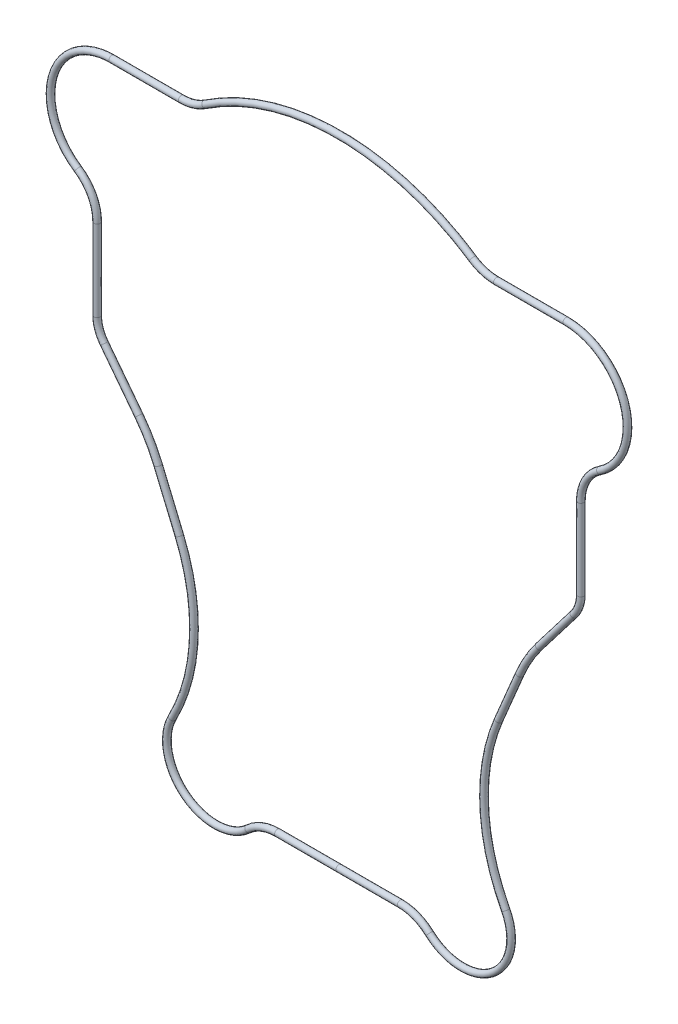
ISO-10303-21;
HEADER;
FILE_DESCRIPTION(('STEP AP214'),'2;1');
FILE_NAME('part.step','',(''),(''),'','','');
FILE_SCHEMA(('AUTOMOTIVE_DESIGN { 1 0 10303 214 1 1 1 1 }'));
ENDSEC;
DATA;
#1=APPLICATION_CONTEXT('core data for automotive mechanical design processes');
#2=APPLICATION_PROTOCOL_DEFINITION('international standard','automotive_design',2000,#1);
#3=PRODUCT_CONTEXT('',#1,'mechanical');
#4=PRODUCT('Part','Part','',(#3));
#5=PRODUCT_RELATED_PRODUCT_CATEGORY('part','',(#4));
#6=PRODUCT_DEFINITION_FORMATION('','',#4);
#7=PRODUCT_DEFINITION_CONTEXT('part definition',#1,'design');
#8=PRODUCT_DEFINITION('design','',#6,#7);
#9=PRODUCT_DEFINITION_SHAPE('','',#8);
#10=(LENGTH_UNIT() NAMED_UNIT(*) SI_UNIT(.MILLI.,.METRE.));
#11=(NAMED_UNIT(*) PLANE_ANGLE_UNIT() SI_UNIT($,.RADIAN.));
#12=(NAMED_UNIT(*) SI_UNIT($,.STERADIAN.) SOLID_ANGLE_UNIT());
#13=UNCERTAINTY_MEASURE_WITH_UNIT(LENGTH_MEASURE(1.E-05),#10,'distance_accuracy_value','');
#14=(GEOMETRIC_REPRESENTATION_CONTEXT(3) GLOBAL_UNCERTAINTY_ASSIGNED_CONTEXT((#13)) GLOBAL_UNIT_ASSIGNED_CONTEXT((#10,
#11,#12)) REPRESENTATION_CONTEXT('',''));
#15=CARTESIAN_POINT('',(0.,0.,0.));
#16=DIRECTION('',(0.,0.,1.));
#17=DIRECTION('',(1.,0.,0.));
#18=AXIS2_PLACEMENT_3D('',#15,#16,#17);
#19=CARTESIAN_POINT('',(0.,-128.,0.));
#20=DIRECTION('',(-1.,0.,0.));
#21=DIRECTION('',(0.,0.,1.));
#22=AXIS2_PLACEMENT_3D('',#19,#20,#21);
#23=CYLINDRICAL_SURFACE('',#22,1.);
#24=CARTESIAN_POINT('',(-19.8992537451964,-128.,0.));
#25=DIRECTION('',(1.,0.,0.));
#26=DIRECTION('',(0.,0.,-1.));
#27=AXIS2_PLACEMENT_3D('',#24,#25,#26);
#28=CIRCLE('',#27,1.);
#29=CARTESIAN_POINT('',(-19.8992537451964,-127.,0.));
#30=VERTEX_POINT('',#29);
#31=EDGE_CURVE('E122',#30,#30,#28,.T.);
#32=ORIENTED_EDGE('',*,*,#31,.T.);
#33=EDGE_LOOP('',(#32));
#34=FACE_BOUND('',#33,.T.);
#35=CARTESIAN_POINT('',(0.,-128.,0.));
#36=DIRECTION('',(1.,0.,0.));
#37=DIRECTION('',(0.,0.,-1.));
#38=AXIS2_PLACEMENT_3D('',#35,#36,#37);
#39=CIRCLE('',#38,1.);
#40=CARTESIAN_POINT('',(0.,-128.,-1.));
#41=VERTEX_POINT('',#40);
#42=EDGE_CURVE('E125',#41,#41,#39,.T.);
#43=ORIENTED_EDGE('',*,*,#42,.F.);
#44=EDGE_LOOP('',(#43));
#45=FACE_BOUND('',#44,.T.);
#46=ADVANCED_FACE('F39',(#34,#45),#23,.T.);
#47=CARTESIAN_POINT('',(-19.8992537451964,-142.,0.));
#48=DIRECTION('',(0.,0.,1.));
#49=DIRECTION('',(1.,0.,0.));
#50=AXIS2_PLACEMENT_3D('',#47,#48,#49);
#51=TOROIDAL_SURFACE('',#50,14.,1.);
#52=CARTESIAN_POINT('',(-29.3425573548357,-131.664429530201,0.));
#53=DIRECTION('',(0.738255033557046,0.674521686402806,0.));
#54=DIRECTION('',(0.,0.,-1.));
#55=AXIS2_PLACEMENT_3D('',#52,#53,#54);
#56=CIRCLE('',#55,1.);
#57=CARTESIAN_POINT('',(-30.0170790412385,-130.926174496644,0.));
#58=VERTEX_POINT('',#57);
#59=EDGE_CURVE('E119',#58,#58,#56,.T.);
#60=CARTESIAN_POINT('',(-19.8992537451964,-142.,0.));
#61=DIRECTION('',(0.,0.,1.));
#62=DIRECTION('',(1.,0.,0.));
#63=AXIS2_PLACEMENT_3D('',#60,#61,#62);
#64=CIRCLE('',#63,15.);
#65=EDGE_CURVE('',#30,#58,#64,.T.);
#66=ORIENTED_EDGE('',*,*,#31,.F.);
#67=ORIENTED_EDGE('',*,*,#59,.T.);
#68=ORIENTED_EDGE('',*,*,#65,.T.);
#69=ORIENTED_EDGE('',*,*,#65,.F.);
#70=EDGE_LOOP('',(#66,#68,#67,#69));
#71=FACE_BOUND('',#70,.T.);
#72=ADVANCED_FACE('F132',(#71),#51,.T.);
#73=CARTESIAN_POINT('',(-40.,-120.,0.));
#74=DIRECTION('',(0.,0.,-1.));
#75=DIRECTION('',(-1.,0.,0.));
#76=AXIS2_PLACEMENT_3D('',#73,#74,#75);
#77=TOROIDAL_SURFACE('',#76,15.8,1.);
#78=CARTESIAN_POINT('',(-53.9991278559812,-112.674399732999,0.));
#79=DIRECTION('',(-0.463645586519069,-0.886020750378561,0.));
#80=DIRECTION('',(0.,0.,-1.));
#81=AXIS2_PLACEMENT_3D('',#78,#79,#80);
#82=CIRCLE('',#81,1.);
#83=CARTESIAN_POINT('',(-53.1131071056026,-113.138045319518,0.));
#84=VERTEX_POINT('',#83);
#85=EDGE_CURVE('E116',#84,#84,#82,.T.);
#86=ORIENTED_EDGE('',*,*,#85,.T.);
#87=EDGE_LOOP('',(#86));
#88=FACE_BOUND('',#87,.T.);
#89=ORIENTED_EDGE('',*,*,#59,.F.);
#90=EDGE_LOOP('',(#89));
#91=FACE_BOUND('',#90,.T.);
#92=ADVANCED_FACE('F138',(#88,#91),#77,.T.);
#93=CARTESIAN_POINT('',(-108.407035747537,-84.2032986274344,0.));
#94=DIRECTION('',(0.,0.,1.));
#95=DIRECTION('',(1.,0.,0.));
#96=AXIS2_PLACEMENT_3D('',#93,#94,#95);
#97=TOROIDAL_SURFACE('',#96,61.4070357475369,1.);
#98=CARTESIAN_POINT('',(-51.7900933453479,-60.4262956134611,0.));
#99=DIRECTION('',(0.387203236966653,-0.921994388964784,0.));
#100=DIRECTION('',(0.,0.,-1.));
#101=AXIS2_PLACEMENT_3D('',#98,#99,#100);
#102=CIRCLE('',#101,1.);
#103=CARTESIAN_POINT('',(-50.8680989563831,-60.0390923764945,0.));
#104=VERTEX_POINT('',#103);
#105=EDGE_CURVE('E113',#104,#104,#102,.T.);
#106=CARTESIAN_POINT('',(-108.407035747537,-84.2032986274344,0.));
#107=DIRECTION('',(0.,0.,1.));
#108=DIRECTION('',(1.,0.,0.));
#109=AXIS2_PLACEMENT_3D('',#106,#107,#108);
#110=CIRCLE('',#109,62.4070357475369);
#111=EDGE_CURVE('',#84,#104,#110,.T.);
#112=ORIENTED_EDGE('',*,*,#85,.F.);
#113=ORIENTED_EDGE('',*,*,#105,.T.);
#114=ORIENTED_EDGE('',*,*,#111,.T.);
#115=ORIENTED_EDGE('',*,*,#111,.F.);
#116=EDGE_LOOP('',(#112,#114,#113,#115));
#117=FACE_BOUND('',#116,.T.);
#118=ADVANCED_FACE('F144',(#117),#97,.T.);
#119=CARTESIAN_POINT('',(-51.7900933453479,-60.4262956134611,0.));
#120=DIRECTION('',(-0.387203236966652,0.921994388964785,0.));
#121=DIRECTION('',(-0.921994388964785,-0.387203236966652,0.));
#122=AXIS2_PLACEMENT_3D('',#119,#120,#121);
#123=CYLINDRICAL_SURFACE('',#122,1.);
#124=CARTESIAN_POINT('',(-58.6290799510559,-44.1415472573643,0.));
#125=DIRECTION('',(0.387203236966652,-0.921994388964785,0.));
#126=DIRECTION('',(0.,0.,-1.));
#127=AXIS2_PLACEMENT_3D('',#124,#125,#126);
#128=CIRCLE('',#127,1.);
#129=CARTESIAN_POINT('',(-57.7070855620911,-43.7543440203976,0.));
#130=VERTEX_POINT('',#129);
#131=EDGE_CURVE('E110',#130,#130,#128,.T.);
#132=ORIENTED_EDGE('',*,*,#131,.T.);
#133=EDGE_LOOP('',(#132));
#134=FACE_BOUND('',#133,.T.);
#135=ORIENTED_EDGE('',*,*,#105,.F.);
#136=EDGE_LOOP('',(#135));
#137=FACE_BOUND('',#136,.T.);
#138=ADVANCED_FACE('F148',(#134,#137),#123,.T.);
#139=CARTESIAN_POINT('',(-103.80680501033,-63.1145058687303,0.));
#140=DIRECTION('',(0.,0.,1.));
#141=DIRECTION('',(1.,0.,0.));
#142=AXIS2_PLACEMENT_3D('',#139,#140,#141);
#143=TOROIDAL_SURFACE('',#142,49.,1.);
#144=CARTESIAN_POINT('',(-64.9324913360597,-33.285195847303,0.));
#145=DIRECTION('',(0.608761429008719,-0.793353340291236,0.));
#146=DIRECTION('',(0.,0.,-1.));
#147=AXIS2_PLACEMENT_3D('',#144,#145,#146);
#148=CIRCLE('',#147,1.);
#149=CARTESIAN_POINT('',(-64.1391379957685,-32.6764344182943,0.));
#150=VERTEX_POINT('',#149);
#151=EDGE_CURVE('E107',#150,#150,#148,.T.);
#152=CARTESIAN_POINT('',(-103.80680501033,-63.1145058687303,0.));
#153=DIRECTION('',(0.,0.,1.));
#154=DIRECTION('',(1.,0.,0.));
#155=AXIS2_PLACEMENT_3D('',#152,#153,#154);
#156=CIRCLE('',#155,50.);
#157=EDGE_CURVE('',#130,#150,#156,.T.);
#158=ORIENTED_EDGE('',*,*,#131,.F.);
#159=ORIENTED_EDGE('',*,*,#151,.T.);
#160=ORIENTED_EDGE('',*,*,#157,.T.);
#161=ORIENTED_EDGE('',*,*,#157,.F.);
#162=EDGE_LOOP('',(#158,#160,#159,#161));
#163=FACE_BOUND('',#162,.T.);
#164=ADVANCED_FACE('F152',(#163),#143,.T.);
#165=CARTESIAN_POINT('',(-64.9324913360597,-33.285195847303,0.));
#166=DIRECTION('',(-0.608761429008717,0.793353340291238,0.));
#167=DIRECTION('',(-0.793353340291238,-0.608761429008717,0.));
#168=AXIS2_PLACEMENT_3D('',#165,#166,#167);
#169=CYLINDRICAL_SURFACE('',#168,1.);
#170=CARTESIAN_POINT('',(-76.1268867432037,-18.6963757190959,0.));
#171=DIRECTION('',(0.608761429008717,-0.793353340291238,0.));
#172=DIRECTION('',(0.,0.,-1.));
#173=AXIS2_PLACEMENT_3D('',#170,#171,#172);
#174=CIRCLE('',#173,1.);
#175=CARTESIAN_POINT('',(-76.9202400834949,-19.3051371481046,0.));
#176=VERTEX_POINT('',#175);
#177=EDGE_CURVE('E104',#176,#176,#174,.T.);
#178=ORIENTED_EDGE('',*,*,#177,.T.);
#179=EDGE_LOOP('',(#178));
#180=FACE_BOUND('',#179,.T.);
#181=ORIENTED_EDGE('',*,*,#151,.F.);
#182=EDGE_LOOP('',(#181));
#183=FACE_BOUND('',#182,.T.);
#184=ADVANCED_FACE('F156',(#180,#183),#169,.T.);
#185=CARTESIAN_POINT('',(-67.4,-12.,0.));
#186=DIRECTION('',(0.,0.,-1.));
#187=DIRECTION('',(-1.,0.,0.));
#188=AXIS2_PLACEMENT_3D('',#185,#186,#187);
#189=TOROIDAL_SURFACE('',#188,11.,1.);
#190=CARTESIAN_POINT('',(-78.4,-12.,0.));
#191=DIRECTION('',(0.,-1.,0.));
#192=DIRECTION('',(0.,0.,-1.));
#193=AXIS2_PLACEMENT_3D('',#190,#191,#192);
#194=CIRCLE('',#193,1.);
#195=CARTESIAN_POINT('',(-79.4,-12.,0.));
#196=VERTEX_POINT('',#195);
#197=EDGE_CURVE('E101',#196,#196,#194,.T.);
#198=CARTESIAN_POINT('',(-67.4,-12.,0.));
#199=DIRECTION('',(0.,0.,-1.));
#200=DIRECTION('',(-1.,0.,0.));
#201=AXIS2_PLACEMENT_3D('',#198,#199,#200);
#202=CIRCLE('',#201,12.);
#203=EDGE_CURVE('',#176,#196,#202,.T.);
#204=ORIENTED_EDGE('',*,*,#177,.F.);
#205=ORIENTED_EDGE('',*,*,#197,.T.);
#206=ORIENTED_EDGE('',*,*,#203,.T.);
#207=ORIENTED_EDGE('',*,*,#203,.F.);
#208=EDGE_LOOP('',(#204,#206,#205,#207));
#209=FACE_BOUND('',#208,.T.);
#210=ADVANCED_FACE('F160',(#209),#189,.T.);
#211=CARTESIAN_POINT('',(-78.4,-12.,0.));
#212=DIRECTION('',(0.,1.,0.));
#213=DIRECTION('',(0.,0.,1.));
#214=AXIS2_PLACEMENT_3D('',#211,#212,#213);
#215=CYLINDRICAL_SURFACE('',#214,1.);
#216=CARTESIAN_POINT('',(-78.4,14.2825046709325,0.));
#217=DIRECTION('',(0.,-1.,0.));
#218=DIRECTION('',(0.,0.,-1.));
#219=AXIS2_PLACEMENT_3D('',#216,#217,#218);
#220=CIRCLE('',#219,1.);
#221=CARTESIAN_POINT('',(-77.4,14.2825046709325,0.));
#222=VERTEX_POINT('',#221);
#223=EDGE_CURVE('E98',#222,#222,#220,.T.);
#224=ORIENTED_EDGE('',*,*,#223,.T.);
#225=EDGE_LOOP('',(#224));
#226=FACE_BOUND('',#225,.T.);
#227=ORIENTED_EDGE('',*,*,#197,.F.);
#228=EDGE_LOOP('',(#227));
#229=FACE_BOUND('',#228,.T.);
#230=ADVANCED_FACE('F164',(#226,#229),#215,.T.);
#231=CARTESIAN_POINT('',(-92.4,14.2825046709325,0.));
#232=DIRECTION('',(0.,0.,1.));
#233=DIRECTION('',(1.,0.,0.));
#234=AXIS2_PLACEMENT_3D('',#231,#232,#233);
#235=TOROIDAL_SURFACE('',#234,14.,1.);
#236=CARTESIAN_POINT('',(-84.6410097493652,25.935747579692,0.));
#237=DIRECTION('',(0.832374493482823,-0.554213589331057,0.));
#238=DIRECTION('',(0.,0.,-1.));
#239=AXIS2_PLACEMENT_3D('',#236,#237,#238);
#240=CIRCLE('',#239,1.);
#241=CARTESIAN_POINT('',(-84.0867961600342,26.7681220731748,0.));
#242=VERTEX_POINT('',#241);
#243=EDGE_CURVE('E95',#242,#242,#240,.T.);
#244=CARTESIAN_POINT('',(-92.4,14.2825046709325,0.));
#245=DIRECTION('',(0.,0.,1.));
#246=DIRECTION('',(1.,0.,0.));
#247=AXIS2_PLACEMENT_3D('',#244,#245,#246);
#248=CIRCLE('',#247,15.);
#249=EDGE_CURVE('',#222,#242,#248,.T.);
#250=ORIENTED_EDGE('',*,*,#223,.F.);
#251=ORIENTED_EDGE('',*,*,#243,.T.);
#252=ORIENTED_EDGE('',*,*,#249,.T.);
#253=ORIENTED_EDGE('',*,*,#249,.F.);
#254=EDGE_LOOP('',(#250,#252,#251,#253));
#255=FACE_BOUND('',#254,.T.);
#256=ADVANCED_FACE('F168',(#255),#235,.T.);
#257=CARTESIAN_POINT('',(-73.6121593216772,42.5000000000001,0.));
#258=DIRECTION('',(0.,0.,-1.));
#259=DIRECTION('',(-1.,0.,0.));
#260=AXIS2_PLACEMENT_3D('',#257,#258,#259);
#261=TOROIDAL_SURFACE('',#260,19.8999999999999,1.);
#262=CARTESIAN_POINT('',(-73.6121593216772,62.4,0.));
#263=DIRECTION('',(-1.,0.,0.));
#264=DIRECTION('',(0.,0.,-1.));
#265=AXIS2_PLACEMENT_3D('',#262,#263,#264);
#266=CIRCLE('',#265,1.);
#267=CARTESIAN_POINT('',(-73.6121593216772,62.4,-1.));
#268=VERTEX_POINT('',#267);
#269=EDGE_CURVE('E92',#268,#268,#266,.T.);
#270=ORIENTED_EDGE('',*,*,#269,.T.);
#271=EDGE_LOOP('',(#270));
#272=FACE_BOUND('',#271,.T.);
#273=ORIENTED_EDGE('',*,*,#243,.F.);
#274=EDGE_LOOP('',(#273));
#275=FACE_BOUND('',#274,.T.);
#276=ADVANCED_FACE('F172',(#272,#275),#261,.T.);
#277=CARTESIAN_POINT('',(-73.6121593216772,62.4,0.));
#278=DIRECTION('',(1.,0.,0.));
#279=DIRECTION('',(0.,0.,-1.));
#280=AXIS2_PLACEMENT_3D('',#277,#278,#279);
#281=CYLINDRICAL_SURFACE('',#280,1.);
#282=CARTESIAN_POINT('',(-51.074944933891,62.4,0.));
#283=DIRECTION('',(-1.,0.,0.));
#284=DIRECTION('',(0.,0.,-1.));
#285=AXIS2_PLACEMENT_3D('',#282,#283,#284);
#286=CIRCLE('',#285,1.);
#287=CARTESIAN_POINT('',(-51.074944933891,61.4,0.));
#288=VERTEX_POINT('',#287);
#289=EDGE_CURVE('E89',#288,#288,#286,.T.);
#290=ORIENTED_EDGE('',*,*,#289,.T.);
#291=EDGE_LOOP('',(#290));
#292=FACE_BOUND('',#291,.T.);
#293=ORIENTED_EDGE('',*,*,#269,.F.);
#294=EDGE_LOOP('',(#293));
#295=FACE_BOUND('',#294,.T.);
#296=ADVANCED_FACE('F176',(#292,#295),#281,.T.);
#297=CARTESIAN_POINT('',(-51.074944933891,76.4,0.));
#298=DIRECTION('',(0.,0.,1.));
#299=DIRECTION('',(1.,0.,0.));
#300=AXIS2_PLACEMENT_3D('',#297,#298,#299);
#301=TOROIDAL_SURFACE('',#300,14.,1.);
#302=CARTESIAN_POINT('',(-43.2942133879229,64.7612622415669,0.));
#303=DIRECTION('',(-0.831338411316649,-0.555766538997725,0.));
#304=DIRECTION('',(0.,0.,-1.));
#305=AXIS2_PLACEMENT_3D('',#302,#303,#304);
#306=CIRCLE('',#305,1.);
#307=CARTESIAN_POINT('',(-42.7384468489252,63.9299238302503,0.));
#308=VERTEX_POINT('',#307);
#309=EDGE_CURVE('E86',#308,#308,#306,.T.);
#310=CARTESIAN_POINT('',(-51.074944933891,76.4,0.));
#311=DIRECTION('',(0.,0.,1.));
#312=DIRECTION('',(1.,0.,0.));
#313=AXIS2_PLACEMENT_3D('',#310,#311,#312);
#314=CIRCLE('',#313,15.);
#315=EDGE_CURVE('',#288,#308,#314,.T.);
#316=ORIENTED_EDGE('',*,*,#289,.F.);
#317=ORIENTED_EDGE('',*,*,#309,.T.);
#318=ORIENTED_EDGE('',*,*,#315,.T.);
#319=ORIENTED_EDGE('',*,*,#315,.F.);
#320=EDGE_LOOP('',(#316,#318,#317,#319));
#321=FACE_BOUND('',#320,.T.);
#322=ADVANCED_FACE('F180',(#321),#301,.T.);
#323=CARTESIAN_POINT('',(0.,0.,0.));
#324=DIRECTION('',(0.,0.,-1.));
#325=DIRECTION('',(-1.,0.,0.));
#326=AXIS2_PLACEMENT_3D('',#323,#324,#325);
#327=TOROIDAL_SURFACE('',#326,77.9,1.);
#328=CARTESIAN_POINT('',(43.2942133879228,64.7612622415669,0.));
#329=DIRECTION('',(-0.831338411316649,0.555766538997726,0.));
#330=DIRECTION('',(0.,0.,-1.));
#331=AXIS2_PLACEMENT_3D('',#328,#329,#330);
#332=CIRCLE('',#331,1.);
#333=CARTESIAN_POINT('',(42.7384468489251,63.9299238302503,0.));
#334=VERTEX_POINT('',#333);
#335=EDGE_CURVE('E83',#334,#334,#332,.T.);
#336=ORIENTED_EDGE('',*,*,#335,.T.);
#337=EDGE_LOOP('',(#336));
#338=FACE_BOUND('',#337,.T.);
#339=ORIENTED_EDGE('',*,*,#309,.F.);
#340=EDGE_LOOP('',(#339));
#341=FACE_BOUND('',#340,.T.);
#342=ADVANCED_FACE('F184',(#338,#341),#327,.T.);
#343=CARTESIAN_POINT('',(51.074944933891,76.4,0.));
#344=DIRECTION('',(0.,0.,1.));
#345=DIRECTION('',(1.,0.,0.));
#346=AXIS2_PLACEMENT_3D('',#343,#344,#345);
#347=TOROIDAL_SURFACE('',#346,14.,1.);
#348=CARTESIAN_POINT('',(51.074944933891,62.4,0.));
#349=DIRECTION('',(-1.,0.,0.));
#350=DIRECTION('',(0.,0.,-1.));
#351=AXIS2_PLACEMENT_3D('',#348,#349,#350);
#352=CIRCLE('',#351,1.);
#353=CARTESIAN_POINT('',(51.074944933891,61.4,0.));
#354=VERTEX_POINT('',#353);
#355=EDGE_CURVE('E80',#354,#354,#352,.T.);
#356=CARTESIAN_POINT('',(51.074944933891,76.4,0.));
#357=DIRECTION('',(0.,0.,1.));
#358=DIRECTION('',(1.,0.,0.));
#359=AXIS2_PLACEMENT_3D('',#356,#357,#358);
#360=CIRCLE('',#359,15.);
#361=EDGE_CURVE('',#334,#354,#360,.T.);
#362=ORIENTED_EDGE('',*,*,#335,.F.);
#363=ORIENTED_EDGE('',*,*,#355,.T.);
#364=ORIENTED_EDGE('',*,*,#361,.T.);
#365=ORIENTED_EDGE('',*,*,#361,.F.);
#366=EDGE_LOOP('',(#362,#364,#363,#365));
#367=FACE_BOUND('',#366,.T.);
#368=ADVANCED_FACE('F188',(#367),#347,.T.);
#369=CARTESIAN_POINT('',(51.074944933891,62.4,0.));
#370=DIRECTION('',(1.,0.,0.));
#371=DIRECTION('',(0.,0.,-1.));
#372=AXIS2_PLACEMENT_3D('',#369,#370,#371);
#373=CYLINDRICAL_SURFACE('',#372,1.);
#374=CARTESIAN_POINT('',(73.6121593216772,62.4,0.));
#375=DIRECTION('',(-1.,0.,0.));
#376=DIRECTION('',(0.,0.,-1.));
#377=AXIS2_PLACEMENT_3D('',#374,#375,#376);
#378=CIRCLE('',#377,1.);
#379=CARTESIAN_POINT('',(73.6121593216772,63.4,0.));
#380=VERTEX_POINT('',#379);
#381=EDGE_CURVE('E77',#380,#380,#378,.T.);
#382=ORIENTED_EDGE('',*,*,#381,.T.);
#383=EDGE_LOOP('',(#382));
#384=FACE_BOUND('',#383,.T.);
#385=ORIENTED_EDGE('',*,*,#355,.F.);
#386=EDGE_LOOP('',(#385));
#387=FACE_BOUND('',#386,.T.);
#388=ADVANCED_FACE('F192',(#384,#387),#373,.T.);
#389=CARTESIAN_POINT('',(73.6121593216772,42.5000000000001,0.));
#390=DIRECTION('',(0.,0.,-1.));
#391=DIRECTION('',(-1.,0.,0.));
#392=AXIS2_PLACEMENT_3D('',#389,#390,#391);
#393=TOROIDAL_SURFACE('',#392,19.8999999999999,1.);
#394=CARTESIAN_POINT('',(84.6410097493652,25.935747579692,0.));
#395=DIRECTION('',(0.832374493482824,0.554213589331056,0.));
#396=DIRECTION('',(0.,0.,-1.));
#397=AXIS2_PLACEMENT_3D('',#394,#395,#396);
#398=CIRCLE('',#397,1.);
#399=CARTESIAN_POINT('',(85.1952233386963,25.1033730862091,0.));
#400=VERTEX_POINT('',#399);
#401=EDGE_CURVE('E74',#400,#400,#398,.T.);
#402=CARTESIAN_POINT('',(73.6121593216772,42.5000000000001,0.));
#403=DIRECTION('',(0.,0.,-1.));
#404=DIRECTION('',(-1.,0.,0.));
#405=AXIS2_PLACEMENT_3D('',#402,#403,#404);
#406=CIRCLE('',#405,20.8999999999999);
#407=EDGE_CURVE('',#380,#400,#406,.T.);
#408=ORIENTED_EDGE('',*,*,#381,.F.);
#409=ORIENTED_EDGE('',*,*,#401,.T.);
#410=ORIENTED_EDGE('',*,*,#407,.T.);
#411=ORIENTED_EDGE('',*,*,#407,.F.);
#412=EDGE_LOOP('',(#408,#410,#409,#411));
#413=FACE_BOUND('',#412,.T.);
#414=ADVANCED_FACE('F196',(#413),#393,.T.);
#415=CARTESIAN_POINT('',(92.4,14.2825046709325,0.));
#416=DIRECTION('',(0.,0.,1.));
#417=DIRECTION('',(1.,0.,0.));
#418=AXIS2_PLACEMENT_3D('',#415,#416,#417);
#419=TOROIDAL_SURFACE('',#418,14.,1.);
#420=CARTESIAN_POINT('',(78.4,14.2825046709325,0.));
#421=DIRECTION('',(0.,1.,0.));
#422=DIRECTION('',(0.,0.,-1.));
#423=AXIS2_PLACEMENT_3D('',#420,#421,#422);
#424=CIRCLE('',#423,1.);
#425=CARTESIAN_POINT('',(78.4,14.2825046709325,-1.));
#426=VERTEX_POINT('',#425);
#427=EDGE_CURVE('E71',#426,#426,#424,.T.);
#428=ORIENTED_EDGE('',*,*,#427,.T.);
#429=EDGE_LOOP('',(#428));
#430=FACE_BOUND('',#429,.T.);
#431=ORIENTED_EDGE('',*,*,#401,.F.);
#432=EDGE_LOOP('',(#431));
#433=FACE_BOUND('',#432,.T.);
#434=ADVANCED_FACE('F200',(#430,#433),#419,.T.);
#435=CARTESIAN_POINT('',(78.4,14.2825046709325,0.));
#436=DIRECTION('',(0.,-1.,0.));
#437=DIRECTION('',(0.,0.,-1.));
#438=AXIS2_PLACEMENT_3D('',#435,#436,#437);
#439=CYLINDRICAL_SURFACE('',#438,1.);
#440=CARTESIAN_POINT('',(78.4,-12.,0.));
#441=DIRECTION('',(0.,1.,0.));
#442=DIRECTION('',(0.,0.,-1.));
#443=AXIS2_PLACEMENT_3D('',#440,#441,#442);
#444=CIRCLE('',#443,1.);
#445=CARTESIAN_POINT('',(79.4,-12.,0.));
#446=VERTEX_POINT('',#445);
#447=EDGE_CURVE('E68',#446,#446,#444,.T.);
#448=ORIENTED_EDGE('',*,*,#447,.T.);
#449=EDGE_LOOP('',(#448));
#450=FACE_BOUND('',#449,.T.);
#451=ORIENTED_EDGE('',*,*,#427,.F.);
#452=EDGE_LOOP('',(#451));
#453=FACE_BOUND('',#452,.T.);
#454=ADVANCED_FACE('F204',(#450,#453),#439,.T.);
#455=CARTESIAN_POINT('',(67.4,-12.,0.));
#456=DIRECTION('',(0.,0.,-1.));
#457=DIRECTION('',(-1.,0.,0.));
#458=AXIS2_PLACEMENT_3D('',#455,#456,#457);
#459=TOROIDAL_SURFACE('',#458,11.,1.);
#460=CARTESIAN_POINT('',(76.1268867432036,-18.6963757190959,0.));
#461=DIRECTION('',(0.608761429008716,0.793353340291239,0.));
#462=DIRECTION('',(0.,0.,-1.));
#463=AXIS2_PLACEMENT_3D('',#460,#461,#462);
#464=CIRCLE('',#463,1.);
#465=CARTESIAN_POINT('',(76.9202400834949,-19.3051371481046,0.));
#466=VERTEX_POINT('',#465);
#467=EDGE_CURVE('E65',#466,#466,#464,.T.);
#468=CARTESIAN_POINT('',(67.4,-12.,0.));
#469=DIRECTION('',(0.,0.,-1.));
#470=DIRECTION('',(-1.,0.,0.));
#471=AXIS2_PLACEMENT_3D('',#468,#469,#470);
#472=CIRCLE('',#471,12.);
#473=EDGE_CURVE('',#446,#466,#472,.T.);
#474=ORIENTED_EDGE('',*,*,#447,.F.);
#475=ORIENTED_EDGE('',*,*,#467,.T.);
#476=ORIENTED_EDGE('',*,*,#473,.T.);
#477=ORIENTED_EDGE('',*,*,#473,.F.);
#478=EDGE_LOOP('',(#474,#476,#475,#477));
#479=FACE_BOUND('',#478,.T.);
#480=ADVANCED_FACE('F208',(#479),#459,.T.);
#481=CARTESIAN_POINT('',(76.1268867432036,-18.6963757190959,0.));
#482=DIRECTION('',(-0.608761429008717,-0.793353340291238,0.));
#483=DIRECTION('',(0.793353340291238,-0.608761429008717,0.));
#484=AXIS2_PLACEMENT_3D('',#481,#482,#483);
#485=CYLINDRICAL_SURFACE('',#484,1.);
#486=CARTESIAN_POINT('',(64.9324913360596,-33.2851958473032,0.));
#487=DIRECTION('',(0.608761429008717,0.793353340291238,0.));
#488=DIRECTION('',(0.,0.,-1.));
#489=AXIS2_PLACEMENT_3D('',#486,#487,#488);
#490=CIRCLE('',#489,1.);
#491=CARTESIAN_POINT('',(64.1391379957684,-32.6764344182944,0.));
#492=VERTEX_POINT('',#491);
#493=EDGE_CURVE('E62',#492,#492,#490,.T.);
#494=ORIENTED_EDGE('',*,*,#493,.T.);
#495=EDGE_LOOP('',(#494));
#496=FACE_BOUND('',#495,.T.);
#497=ORIENTED_EDGE('',*,*,#467,.F.);
#498=EDGE_LOOP('',(#497));
#499=FACE_BOUND('',#498,.T.);
#500=ADVANCED_FACE('F212',(#496,#499),#485,.T.);
#501=CARTESIAN_POINT('',(103.80680501033,-63.1145058687302,0.));
#502=DIRECTION('',(0.,0.,1.));
#503=DIRECTION('',(1.,0.,0.));
#504=AXIS2_PLACEMENT_3D('',#501,#502,#503);
#505=TOROIDAL_SURFACE('',#504,49.,1.);
#506=CARTESIAN_POINT('',(58.6290799510558,-44.1415472573644,0.));
#507=DIRECTION('',(0.387203236966649,0.921994388964786,0.));
#508=DIRECTION('',(0.,0.,-1.));
#509=AXIS2_PLACEMENT_3D('',#506,#507,#508);
#510=CIRCLE('',#509,1.);
#511=CARTESIAN_POINT('',(57.707085562091,-43.7543440203978,0.));
#512=VERTEX_POINT('',#511);
#513=EDGE_CURVE('E59',#512,#512,#510,.T.);
#514=CARTESIAN_POINT('',(103.80680501033,-63.1145058687302,0.));
#515=DIRECTION('',(0.,0.,1.));
#516=DIRECTION('',(1.,0.,0.));
#517=AXIS2_PLACEMENT_3D('',#514,#515,#516);
#518=CIRCLE('',#517,50.);
#519=EDGE_CURVE('',#492,#512,#518,.T.);
#520=ORIENTED_EDGE('',*,*,#493,.F.);
#521=ORIENTED_EDGE('',*,*,#513,.T.);
#522=ORIENTED_EDGE('',*,*,#519,.T.);
#523=ORIENTED_EDGE('',*,*,#519,.F.);
#524=EDGE_LOOP('',(#520,#522,#521,#523));
#525=FACE_BOUND('',#524,.T.);
#526=ADVANCED_FACE('F216',(#525),#505,.T.);
#527=CARTESIAN_POINT('',(58.6290799510558,-44.1415472573644,0.));
#528=DIRECTION('',(-0.387203236966652,-0.921994388964785,0.));
#529=DIRECTION('',(0.921994388964785,-0.387203236966652,0.));
#530=AXIS2_PLACEMENT_3D('',#527,#528,#529);
#531=CYLINDRICAL_SURFACE('',#530,1.);
#532=CARTESIAN_POINT('',(51.7900933453479,-60.4262956134612,0.));
#533=DIRECTION('',(0.387203236966652,0.921994388964785,0.));
#534=DIRECTION('',(0.,0.,-1.));
#535=AXIS2_PLACEMENT_3D('',#532,#533,#534);
#536=CIRCLE('',#535,1.);
#537=CARTESIAN_POINT('',(50.8680989563831,-60.0390923764946,0.));
#538=VERTEX_POINT('',#537);
#539=EDGE_CURVE('E54',#538,#538,#536,.T.);
#540=ORIENTED_EDGE('',*,*,#539,.T.);
#541=EDGE_LOOP('',(#540));
#542=FACE_BOUND('',#541,.T.);
#543=ORIENTED_EDGE('',*,*,#513,.F.);
#544=EDGE_LOOP('',(#543));
#545=FACE_BOUND('',#544,.T.);
#546=ADVANCED_FACE('F220',(#542,#545),#531,.T.);
#547=CARTESIAN_POINT('',(108.407035747537,-84.2032986274344,0.));
#548=DIRECTION('',(0.,0.,1.));
#549=DIRECTION('',(1.,0.,0.));
#550=AXIS2_PLACEMENT_3D('',#547,#548,#549);
#551=TOROIDAL_SURFACE('',#550,61.4070357475368,1.);
#552=CARTESIAN_POINT('',(53.9991278559812,-112.674399732999,0.));
#553=DIRECTION('',(-0.463645586519072,0.88602075037856,0.));
#554=DIRECTION('',(0.,0.,-1.));
#555=AXIS2_PLACEMENT_3D('',#552,#553,#554);
#556=CIRCLE('',#555,1.);
#557=CARTESIAN_POINT('',(53.1131071056027,-113.138045319518,0.));
#558=VERTEX_POINT('',#557);
#559=EDGE_CURVE('E50',#558,#558,#556,.T.);
#560=CARTESIAN_POINT('',(108.407035747537,-84.2032986274344,0.));
#561=DIRECTION('',(0.,0.,1.));
#562=DIRECTION('',(1.,0.,0.));
#563=AXIS2_PLACEMENT_3D('',#560,#561,#562);
#564=CIRCLE('',#563,62.4070357475368);
#565=EDGE_CURVE('',#538,#558,#564,.T.);
#566=ORIENTED_EDGE('',*,*,#539,.F.);
#567=ORIENTED_EDGE('',*,*,#559,.T.);
#568=ORIENTED_EDGE('',*,*,#565,.T.);
#569=ORIENTED_EDGE('',*,*,#565,.F.);
#570=EDGE_LOOP('',(#566,#568,#567,#569));
#571=FACE_BOUND('',#570,.T.);
#572=ADVANCED_FACE('F224',(#571),#551,.T.);
#573=CARTESIAN_POINT('',(40.,-120.,0.));
#574=DIRECTION('',(0.,0.,-1.));
#575=DIRECTION('',(-1.,0.,0.));
#576=AXIS2_PLACEMENT_3D('',#573,#574,#575);
#577=TOROIDAL_SURFACE('',#576,15.8,1.);
#578=CARTESIAN_POINT('',(29.3425573548357,-131.664429530201,0.));
#579=DIRECTION('',(0.738255033557047,-0.674521686402805,0.));
#580=DIRECTION('',(0.,0.,-1.));
#581=AXIS2_PLACEMENT_3D('',#578,#579,#580);
#582=CIRCLE('',#581,1.);
#583=CARTESIAN_POINT('',(30.0170790412385,-130.926174496644,0.));
#584=VERTEX_POINT('',#583);
#585=EDGE_CURVE('E46',#584,#584,#582,.T.);
#586=ORIENTED_EDGE('',*,*,#585,.T.);
#587=EDGE_LOOP('',(#586));
#588=FACE_BOUND('',#587,.T.);
#589=ORIENTED_EDGE('',*,*,#559,.F.);
#590=EDGE_LOOP('',(#589));
#591=FACE_BOUND('',#590,.T.);
#592=ADVANCED_FACE('F228',(#588,#591),#577,.T.);
#593=CARTESIAN_POINT('',(19.8992537451964,-142.,0.));
#594=DIRECTION('',(0.,0.,1.));
#595=DIRECTION('',(1.,0.,0.));
#596=AXIS2_PLACEMENT_3D('',#593,#594,#595);
#597=TOROIDAL_SURFACE('',#596,14.,1.);
#598=CARTESIAN_POINT('',(19.8992537451964,-128.,0.));
#599=DIRECTION('',(1.,0.,0.));
#600=DIRECTION('',(0.,0.,-1.));
#601=AXIS2_PLACEMENT_3D('',#598,#599,#600);
#602=CIRCLE('',#601,1.);
#603=CARTESIAN_POINT('',(19.8992537451964,-127.,0.));
#604=VERTEX_POINT('',#603);
#605=EDGE_CURVE('E10',#604,#604,#602,.T.);
#606=CARTESIAN_POINT('',(19.8992537451964,-142.,0.));
#607=DIRECTION('',(0.,0.,1.));
#608=DIRECTION('',(1.,0.,0.));
#609=AXIS2_PLACEMENT_3D('',#606,#607,#608);
#610=CIRCLE('',#609,15.);
#611=EDGE_CURVE('',#584,#604,#610,.T.);
#612=ORIENTED_EDGE('',*,*,#585,.F.);
#613=ORIENTED_EDGE('',*,*,#605,.T.);
#614=ORIENTED_EDGE('',*,*,#611,.T.);
#615=ORIENTED_EDGE('',*,*,#611,.F.);
#616=EDGE_LOOP('',(#612,#614,#613,#615));
#617=FACE_BOUND('',#616,.T.);
#618=ADVANCED_FACE('F231',(#617),#597,.T.);
#619=CARTESIAN_POINT('',(19.8992537451964,-128.,0.));
#620=DIRECTION('',(-1.,0.,0.));
#621=DIRECTION('',(0.,0.,1.));
#622=AXIS2_PLACEMENT_3D('',#619,#620,#621);
#623=CYLINDRICAL_SURFACE('',#622,1.);
#624=ORIENTED_EDGE('',*,*,#42,.T.);
#625=EDGE_LOOP('',(#624));
#626=FACE_BOUND('',#625,.T.);
#627=ORIENTED_EDGE('',*,*,#605,.F.);
#628=EDGE_LOOP('',(#627));
#629=FACE_BOUND('',#628,.T.);
#630=ADVANCED_FACE('F41',(#626,#629),#623,.T.);
#631=CLOSED_SHELL('',(#46,#72,#92,#118,#138,#164,#184,#210,#230,#256,#276,#296,#322,#342,#368,
#388,#414,#434,#454,#480,#500,#526,#546,#572,#592,#618,#630));
#632=MANIFOLD_SOLID_BREP('B2',#631);
#633=ADVANCED_BREP_SHAPE_REPRESENTATION('',(#18,#632),#14);
#634=SHAPE_DEFINITION_REPRESENTATION(#9,#633);
ENDSEC;
END-ISO-10303-21;
